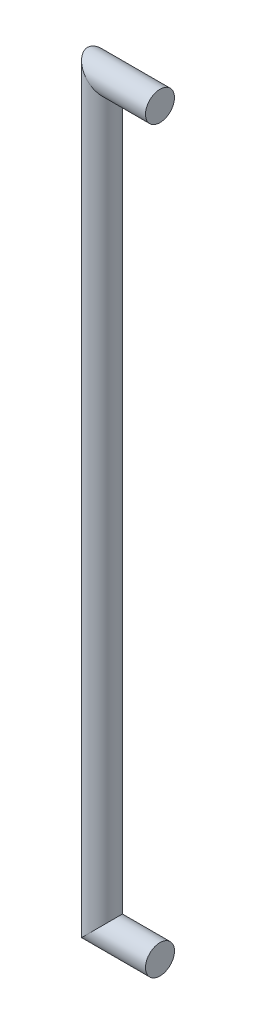
ISO-10303-21;
HEADER;
FILE_DESCRIPTION(('STEP AP214'),'2;1');
FILE_NAME('part.step','',(''),(''),'','','');
FILE_SCHEMA(('AUTOMOTIVE_DESIGN { 1 0 10303 214 1 1 1 1 }'));
ENDSEC;
DATA;
#1=APPLICATION_CONTEXT('core data for automotive mechanical design processes');
#2=APPLICATION_PROTOCOL_DEFINITION('international standard','automotive_design',2000,#1);
#3=PRODUCT_CONTEXT('',#1,'mechanical');
#4=PRODUCT('Part','Part','',(#3));
#5=PRODUCT_RELATED_PRODUCT_CATEGORY('part','',(#4));
#6=PRODUCT_DEFINITION_FORMATION('','',#4);
#7=PRODUCT_DEFINITION_CONTEXT('part definition',#1,'design');
#8=PRODUCT_DEFINITION('design','',#6,#7);
#9=PRODUCT_DEFINITION_SHAPE('','',#8);
#10=(LENGTH_UNIT() NAMED_UNIT(*) SI_UNIT(.MILLI.,.METRE.));
#11=(NAMED_UNIT(*) PLANE_ANGLE_UNIT() SI_UNIT($,.RADIAN.));
#12=(NAMED_UNIT(*) SI_UNIT($,.STERADIAN.) SOLID_ANGLE_UNIT());
#13=UNCERTAINTY_MEASURE_WITH_UNIT(LENGTH_MEASURE(1.E-05),#10,'distance_accuracy_value','');
#14=(GEOMETRIC_REPRESENTATION_CONTEXT(3) GLOBAL_UNCERTAINTY_ASSIGNED_CONTEXT((#13)) GLOBAL_UNIT_ASSIGNED_CONTEXT((#10,
#11,#12)) REPRESENTATION_CONTEXT('',''));
#15=CARTESIAN_POINT('',(0.,0.,0.));
#16=DIRECTION('',(0.,0.,1.));
#17=DIRECTION('',(1.,0.,0.));
#18=AXIS2_PLACEMENT_3D('',#15,#16,#17);
#19=CARTESIAN_POINT('',(0.,-255.,0.));
#20=DIRECTION('',(-1.,0.,0.));
#21=DIRECTION('',(0.,0.,1.));
#22=AXIS2_PLACEMENT_3D('',#19,#20,#21);
#23=PLANE('',#22);
#24=CARTESIAN_POINT('',(0.,-255.,0.));
#25=DIRECTION('',(-1.,0.,0.));
#26=DIRECTION('',(0.,0.,1.));
#27=AXIS2_PLACEMENT_3D('',#24,#25,#26);
#28=CIRCLE('',#27,5.);
#29=CARTESIAN_POINT('',(0.,-255.,5.));
#30=VERTEX_POINT('',#29);
#31=EDGE_CURVE('E46',#30,#30,#28,.T.);
#32=ORIENTED_EDGE('',*,*,#31,.F.);
#33=EDGE_LOOP('',(#32));
#34=FACE_BOUND('',#33,.T.);
#35=ADVANCED_FACE('F43',(#34),#23,.F.);
#36=CARTESIAN_POINT('',(0.,0.,0.));
#37=DIRECTION('',(1.,0.,0.));
#38=DIRECTION('',(0.,0.,1.));
#39=AXIS2_PLACEMENT_3D('',#36,#37,#38);
#40=PLANE('',#39);
#41=CARTESIAN_POINT('',(0.,0.,0.));
#42=DIRECTION('',(1.,0.,0.));
#43=DIRECTION('',(0.,0.,1.));
#44=AXIS2_PLACEMENT_3D('',#41,#42,#43);
#45=CIRCLE('',#44,5.);
#46=CARTESIAN_POINT('',(0.,0.,5.));
#47=VERTEX_POINT('',#46);
#48=EDGE_CURVE('E49',#47,#47,#45,.T.);
#49=ORIENTED_EDGE('',*,*,#48,.T.);
#50=EDGE_LOOP('',(#49));
#51=FACE_BOUND('',#50,.T.);
#52=ADVANCED_FACE('F67',(#51),#40,.T.);
#53=CARTESIAN_POINT('',(-31.1,-255.,0.));
#54=DIRECTION('',(1.,0.,0.));
#55=DIRECTION('',(0.,0.,-1.));
#56=AXIS2_PLACEMENT_3D('',#53,#54,#55);
#57=CYLINDRICAL_SURFACE('',#56,5.);
#58=CARTESIAN_POINT('',(-20.,-255.,0.));
#59=DIRECTION('',(0.707106781186548,-0.707106781186547,0.));
#60=DIRECTION('',(-0.707106781186547,-0.707106781186548,0.));
#61=AXIS2_PLACEMENT_3D('',#58,#59,#60);
#62=ELLIPSE('',#61,7.07106781186547,5.);
#63=CARTESIAN_POINT('',(-25.,-260.,0.));
#64=VERTEX_POINT('',#63);
#65=EDGE_CURVE('E54',#64,#64,#62,.T.);
#66=ORIENTED_EDGE('',*,*,#65,.T.);
#67=EDGE_LOOP('',(#66));
#68=FACE_BOUND('',#67,.T.);
#69=ORIENTED_EDGE('',*,*,#31,.T.);
#70=EDGE_LOOP('',(#69));
#71=FACE_BOUND('',#70,.T.);
#72=ADVANCED_FACE('F64',(#68,#71),#57,.T.);
#73=CARTESIAN_POINT('',(-20.,11.1,0.));
#74=DIRECTION('',(0.,-1.,0.));
#75=DIRECTION('',(1.,0.,0.));
#76=AXIS2_PLACEMENT_3D('',#73,#74,#75);
#77=CYLINDRICAL_SURFACE('',#76,5.);
#78=CARTESIAN_POINT('',(-20.,0.,0.));
#79=DIRECTION('',(-0.707106781186547,-0.707106781186548,0.));
#80=DIRECTION('',(-0.707106781186548,0.707106781186547,0.));
#81=AXIS2_PLACEMENT_3D('',#78,#79,#80);
#82=ELLIPSE('',#81,7.07106781186548,5.);
#83=CARTESIAN_POINT('',(-25.,5.,0.));
#84=VERTEX_POINT('',#83);
#85=EDGE_CURVE('E11',#84,#84,#82,.T.);
#86=ORIENTED_EDGE('',*,*,#85,.T.);
#87=EDGE_LOOP('',(#86));
#88=FACE_BOUND('',#87,.T.);
#89=ORIENTED_EDGE('',*,*,#65,.F.);
#90=EDGE_LOOP('',(#89));
#91=FACE_BOUND('',#90,.T.);
#92=ADVANCED_FACE('F74',(#88,#91),#77,.T.);
#93=CARTESIAN_POINT('',(0.,0.,0.));
#94=DIRECTION('',(-1.,0.,0.));
#95=DIRECTION('',(0.,-1.,0.));
#96=AXIS2_PLACEMENT_3D('',#93,#94,#95);
#97=CYLINDRICAL_SURFACE('',#96,5.);
#98=ORIENTED_EDGE('',*,*,#48,.F.);
#99=EDGE_LOOP('',(#98));
#100=FACE_BOUND('',#99,.T.);
#101=ORIENTED_EDGE('',*,*,#85,.F.);
#102=EDGE_LOOP('',(#101));
#103=FACE_BOUND('',#102,.T.);
#104=ADVANCED_FACE('F71',(#100,#103),#97,.T.);
#105=CLOSED_SHELL('',(#35,#52,#72,#92,#104));
#106=MANIFOLD_SOLID_BREP('B2',#105);
#107=ADVANCED_BREP_SHAPE_REPRESENTATION('',(#18,#106),#14);
#108=SHAPE_DEFINITION_REPRESENTATION(#9,#107);
ENDSEC;
END-ISO-10303-21;
